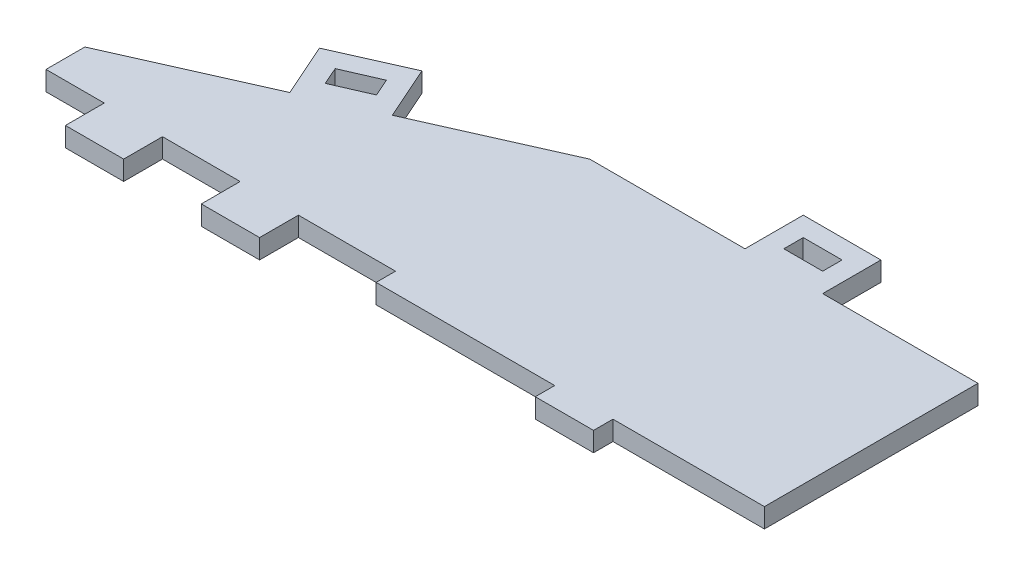
ISO-10303-21;
HEADER;
FILE_DESCRIPTION(('STEP AP214'),'2;1');
FILE_NAME('part.step','',(''),(''),'','','');
FILE_SCHEMA(('AUTOMOTIVE_DESIGN { 1 0 10303 214 1 1 1 1 }'));
ENDSEC;
DATA;
#1=APPLICATION_CONTEXT('core data for automotive mechanical design processes');
#2=APPLICATION_PROTOCOL_DEFINITION('international standard','automotive_design',2000,#1);
#3=PRODUCT_CONTEXT('',#1,'mechanical');
#4=PRODUCT('Part','Part','',(#3));
#5=PRODUCT_RELATED_PRODUCT_CATEGORY('part','',(#4));
#6=PRODUCT_DEFINITION_FORMATION('','',#4);
#7=PRODUCT_DEFINITION_CONTEXT('part definition',#1,'design');
#8=PRODUCT_DEFINITION('design','',#6,#7);
#9=PRODUCT_DEFINITION_SHAPE('','',#8);
#10=(LENGTH_UNIT() NAMED_UNIT(*) SI_UNIT(.MILLI.,.METRE.));
#11=(NAMED_UNIT(*) PLANE_ANGLE_UNIT() SI_UNIT($,.RADIAN.));
#12=(NAMED_UNIT(*) SI_UNIT($,.STERADIAN.) SOLID_ANGLE_UNIT());
#13=UNCERTAINTY_MEASURE_WITH_UNIT(LENGTH_MEASURE(1.E-05),#10,'distance_accuracy_value','');
#14=(GEOMETRIC_REPRESENTATION_CONTEXT(3) GLOBAL_UNCERTAINTY_ASSIGNED_CONTEXT((#13)) GLOBAL_UNIT_ASSIGNED_CONTEXT((#10,
#11,#12)) REPRESENTATION_CONTEXT('',''));
#15=CARTESIAN_POINT('',(0.,0.,0.));
#16=DIRECTION('',(0.,0.,1.));
#17=DIRECTION('',(1.,0.,0.));
#18=AXIS2_PLACEMENT_3D('',#15,#16,#17);
#19=CARTESIAN_POINT('',(0.,5.,0.));
#20=DIRECTION('',(0.,-1.,0.));
#21=DIRECTION('',(0.,0.,-1.));
#22=AXIS2_PLACEMENT_3D('',#19,#20,#21);
#23=PLANE('',#22);
#24=DIRECTION('',(1.,0.,0.));
#25=VECTOR('',#24,1.);
#26=CARTESIAN_POINT('',(135.,5.,-55.));
#27=LINE('',#26,#25);
#28=CARTESIAN_POINT('',(135.,5.,-55.));
#29=VERTEX_POINT('',#28);
#30=CARTESIAN_POINT('',(145.,5.,-55.));
#31=VERTEX_POINT('',#30);
#32=EDGE_CURVE('E298',#29,#31,#27,.T.);
#33=ORIENTED_EDGE('',*,*,#32,.F.);
#34=DIRECTION('',(0.,0.,1.));
#35=VECTOR('',#34,1.);
#36=CARTESIAN_POINT('',(135.,5.,-55.));
#37=LINE('',#36,#35);
#38=CARTESIAN_POINT('',(135.,5.,-60.));
#39=VERTEX_POINT('',#38);
#40=EDGE_CURVE('E306',#39,#29,#37,.T.);
#41=ORIENTED_EDGE('',*,*,#40,.F.);
#42=DIRECTION('',(-1.,0.,0.));
#43=VECTOR('',#42,1.);
#44=CARTESIAN_POINT('',(135.,5.,-60.));
#45=LINE('',#44,#43);
#46=CARTESIAN_POINT('',(145.,5.,-60.));
#47=VERTEX_POINT('',#46);
#48=EDGE_CURVE('E303',#47,#39,#45,.T.);
#49=ORIENTED_EDGE('',*,*,#48,.F.);
#50=DIRECTION('',(0.,0.,-1.));
#51=VECTOR('',#50,1.);
#52=CARTESIAN_POINT('',(145.,5.,-55.));
#53=LINE('',#52,#51);
#54=EDGE_CURVE('E300',#31,#47,#53,.T.);
#55=ORIENTED_EDGE('',*,*,#54,.F.);
#56=EDGE_LOOP('',(#33,#41,#49,#55));
#57=FACE_BOUND('',#56,.T.);
#58=DIRECTION('',(0.,0.,1.));
#59=VECTOR('',#58,1.);
#60=CARTESIAN_POINT('',(0.,5.,0.));
#61=LINE('',#60,#59);
#62=CARTESIAN_POINT('',(0.,5.,-10.));
#63=VERTEX_POINT('',#62);
#64=CARTESIAN_POINT('',(0.,5.,0.));
#65=VERTEX_POINT('',#64);
#66=EDGE_CURVE('E329',#63,#65,#61,.T.);
#67=ORIENTED_EDGE('',*,*,#66,.T.);
#68=DIRECTION('',(1.,0.,0.));
#69=VECTOR('',#68,1.);
#70=CARTESIAN_POINT('',(0.,5.,0.));
#71=LINE('',#70,#69);
#72=CARTESIAN_POINT('',(15.,5.,0.));
#73=VERTEX_POINT('',#72);
#74=EDGE_CURVE('E332',#65,#73,#71,.T.);
#75=ORIENTED_EDGE('',*,*,#74,.T.);
#76=DIRECTION('',(0.,0.,1.));
#77=VECTOR('',#76,1.);
#78=CARTESIAN_POINT('',(15.,5.,0.));
#79=LINE('',#78,#77);
#80=CARTESIAN_POINT('',(15.,5.,10.));
#81=VERTEX_POINT('',#80);
#82=EDGE_CURVE('E335',#73,#81,#79,.T.);
#83=ORIENTED_EDGE('',*,*,#82,.T.);
#84=DIRECTION('',(1.,0.,0.));
#85=VECTOR('',#84,1.);
#86=CARTESIAN_POINT('',(15.,5.,10.));
#87=LINE('',#86,#85);
#88=CARTESIAN_POINT('',(30.,5.,10.));
#89=VERTEX_POINT('',#88);
#90=EDGE_CURVE('E337',#81,#89,#87,.T.);
#91=ORIENTED_EDGE('',*,*,#90,.T.);
#92=DIRECTION('',(0.,0.,-1.));
#93=VECTOR('',#92,1.);
#94=CARTESIAN_POINT('',(30.,5.,10.));
#95=LINE('',#94,#93);
#96=CARTESIAN_POINT('',(30.,5.,0.));
#97=VERTEX_POINT('',#96);
#98=EDGE_CURVE('E339',#89,#97,#95,.T.);
#99=ORIENTED_EDGE('',*,*,#98,.T.);
#100=DIRECTION('',(1.,0.,0.));
#101=VECTOR('',#100,1.);
#102=CARTESIAN_POINT('',(30.,5.,0.));
#103=LINE('',#102,#101);
#104=CARTESIAN_POINT('',(50.,5.,0.));
#105=VERTEX_POINT('',#104);
#106=EDGE_CURVE('E341',#97,#105,#103,.T.);
#107=ORIENTED_EDGE('',*,*,#106,.T.);
#108=DIRECTION('',(0.,0.,1.));
#109=VECTOR('',#108,1.);
#110=CARTESIAN_POINT('',(50.,5.,0.));
#111=LINE('',#110,#109);
#112=CARTESIAN_POINT('',(50.,5.,10.));
#113=VERTEX_POINT('',#112);
#114=EDGE_CURVE('E343',#105,#113,#111,.T.);
#115=ORIENTED_EDGE('',*,*,#114,.T.);
#116=DIRECTION('',(1.,0.,0.));
#117=VECTOR('',#116,1.);
#118=CARTESIAN_POINT('',(50.,5.,10.));
#119=LINE('',#118,#117);
#120=CARTESIAN_POINT('',(65.,5.,10.));
#121=VERTEX_POINT('',#120);
#122=EDGE_CURVE('E345',#113,#121,#119,.T.);
#123=ORIENTED_EDGE('',*,*,#122,.T.);
#124=DIRECTION('',(0.,0.,-1.));
#125=VECTOR('',#124,1.);
#126=CARTESIAN_POINT('',(65.,5.,10.));
#127=LINE('',#126,#125);
#128=CARTESIAN_POINT('',(65.,5.,0.));
#129=VERTEX_POINT('',#128);
#130=EDGE_CURVE('E347',#121,#129,#127,.T.);
#131=ORIENTED_EDGE('',*,*,#130,.T.);
#132=DIRECTION('',(1.,0.,0.));
#133=VECTOR('',#132,1.);
#134=CARTESIAN_POINT('',(65.,5.,0.));
#135=LINE('',#134,#133);
#136=CARTESIAN_POINT('',(90.,5.,0.));
#137=VERTEX_POINT('',#136);
#138=EDGE_CURVE('E349',#129,#137,#135,.T.);
#139=ORIENTED_EDGE('',*,*,#138,.T.);
#140=DIRECTION('',(0.,0.,1.));
#141=VECTOR('',#140,1.);
#142=CARTESIAN_POINT('',(90.,5.,0.));
#143=LINE('',#142,#141);
#144=CARTESIAN_POINT('',(90.,5.,5.));
#145=VERTEX_POINT('',#144);
#146=EDGE_CURVE('E351',#137,#145,#143,.T.);
#147=ORIENTED_EDGE('',*,*,#146,.T.);
#148=DIRECTION('',(1.,0.,0.));
#149=VECTOR('',#148,1.);
#150=CARTESIAN_POINT('',(136.,5.,4.99999999999999));
#151=LINE('',#150,#149);
#152=CARTESIAN_POINT('',(136.,5.,4.99999999999999));
#153=VERTEX_POINT('',#152);
#154=EDGE_CURVE('E353',#145,#153,#151,.T.);
#155=ORIENTED_EDGE('',*,*,#154,.T.);
#156=DIRECTION('',(0.,0.,1.));
#157=VECTOR('',#156,1.);
#158=CARTESIAN_POINT('',(136.,5.,4.99999999999999));
#159=LINE('',#158,#157);
#160=CARTESIAN_POINT('',(136.,5.,9.99999999999999));
#161=VERTEX_POINT('',#160);
#162=EDGE_CURVE('E355',#153,#161,#159,.T.);
#163=ORIENTED_EDGE('',*,*,#162,.T.);
#164=DIRECTION('',(1.,0.,0.));
#165=VECTOR('',#164,1.);
#166=CARTESIAN_POINT('',(136.,5.,9.99999999999999));
#167=LINE('',#166,#165);
#168=CARTESIAN_POINT('',(151.,5.,10.));
#169=VERTEX_POINT('',#168);
#170=EDGE_CURVE('E357',#161,#169,#167,.T.);
#171=ORIENTED_EDGE('',*,*,#170,.T.);
#172=DIRECTION('',(0.,0.,-1.));
#173=VECTOR('',#172,1.);
#174=CARTESIAN_POINT('',(151.,5.,4.99999999999999));
#175=LINE('',#174,#173);
#176=CARTESIAN_POINT('',(151.,5.,4.99999999999999));
#177=VERTEX_POINT('',#176);
#178=EDGE_CURVE('E359',#169,#177,#175,.T.);
#179=ORIENTED_EDGE('',*,*,#178,.T.);
#180=DIRECTION('',(1.,0.,0.));
#181=VECTOR('',#180,1.);
#182=CARTESIAN_POINT('',(190.,5.,4.99999999999999));
#183=LINE('',#182,#181);
#184=CARTESIAN_POINT('',(190.,5.,4.99999999999999));
#185=VERTEX_POINT('',#184);
#186=EDGE_CURVE('E361',#177,#185,#183,.T.);
#187=ORIENTED_EDGE('',*,*,#186,.T.);
#188=DIRECTION('',(0.,0.,-1.));
#189=VECTOR('',#188,1.);
#190=CARTESIAN_POINT('',(190.,5.,-50.));
#191=LINE('',#190,#189);
#192=CARTESIAN_POINT('',(190.,5.,-50.));
#193=VERTEX_POINT('',#192);
#194=EDGE_CURVE('E363',#185,#193,#191,.T.);
#195=ORIENTED_EDGE('',*,*,#194,.T.);
#196=DIRECTION('',(-1.,0.,0.));
#197=VECTOR('',#196,1.);
#198=CARTESIAN_POINT('',(150.,5.,-50.));
#199=LINE('',#198,#197);
#200=CARTESIAN_POINT('',(150.,5.,-50.));
#201=VERTEX_POINT('',#200);
#202=EDGE_CURVE('E365',#193,#201,#199,.T.);
#203=ORIENTED_EDGE('',*,*,#202,.T.);
#204=DIRECTION('',(0.,0.,-1.));
#205=VECTOR('',#204,1.);
#206=CARTESIAN_POINT('',(150.,5.,-50.));
#207=LINE('',#206,#205);
#208=CARTESIAN_POINT('',(150.,5.,-65.));
#209=VERTEX_POINT('',#208);
#210=EDGE_CURVE('E367',#201,#209,#207,.T.);
#211=ORIENTED_EDGE('',*,*,#210,.T.);
#212=DIRECTION('',(-1.,0.,0.));
#213=VECTOR('',#212,1.);
#214=CARTESIAN_POINT('',(130.,5.,-65.));
#215=LINE('',#214,#213);
#216=CARTESIAN_POINT('',(130.,5.,-65.));
#217=VERTEX_POINT('',#216);
#218=EDGE_CURVE('E369',#209,#217,#215,.T.);
#219=ORIENTED_EDGE('',*,*,#218,.T.);
#220=DIRECTION('',(0.,0.,1.));
#221=VECTOR('',#220,1.);
#222=CARTESIAN_POINT('',(130.,5.,-50.));
#223=LINE('',#222,#221);
#224=CARTESIAN_POINT('',(130.,5.,-50.));
#225=VERTEX_POINT('',#224);
#226=EDGE_CURVE('E371',#217,#225,#223,.T.);
#227=ORIENTED_EDGE('',*,*,#226,.T.);
#228=DIRECTION('',(-1.,0.,0.));
#229=VECTOR('',#228,1.);
#230=CARTESIAN_POINT('',(90.,5.,-50.));
#231=LINE('',#230,#229);
#232=CARTESIAN_POINT('',(90.,5.,-50.));
#233=VERTEX_POINT('',#232);
#234=EDGE_CURVE('E373',#225,#233,#231,.T.);
#235=ORIENTED_EDGE('',*,*,#234,.T.);
#236=DIRECTION('',(-0.913811548620257,0.,0.406138466053448));
#237=VECTOR('',#236,1.);
#238=CARTESIAN_POINT('',(54.8286929172154,5.,-34.3683079632069));
#239=LINE('',#238,#237);
#240=CARTESIAN_POINT('',(54.8286929172154,5.,-34.3683079632069));
#241=VERTEX_POINT('',#240);
#242=EDGE_CURVE('E375',#233,#241,#239,.T.);
#243=ORIENTED_EDGE('',*,*,#242,.T.);
#244=DIRECTION('',(-0.406138466053448,0.,-0.913811548620257));
#245=VECTOR('',#244,1.);
#246=CARTESIAN_POINT('',(48.7366159264137,5.,-48.0754811925107));
#247=LINE('',#246,#245);
#248=CARTESIAN_POINT('',(48.7366159264137,5.,-48.0754811925107));
#249=VERTEX_POINT('',#248);
#250=EDGE_CURVE('E377',#241,#249,#247,.T.);
#251=ORIENTED_EDGE('',*,*,#250,.T.);
#252=DIRECTION('',(-0.913811548620257,0.,0.406138466053448));
#253=VECTOR('',#252,1.);
#254=CARTESIAN_POINT('',(30.4603849540086,5.,-39.9527118714418));
#255=LINE('',#254,#253);
#256=CARTESIAN_POINT('',(30.4603849540086,5.,-39.9527118714418));
#257=VERTEX_POINT('',#256);
#258=EDGE_CURVE('E379',#249,#257,#255,.T.);
#259=ORIENTED_EDGE('',*,*,#258,.T.);
#260=DIRECTION('',(0.406138466053448,0.,0.913811548620257));
#261=VECTOR('',#260,1.);
#262=CARTESIAN_POINT('',(36.5524619448103,5.,-26.2455386421379));
#263=LINE('',#262,#261);
#264=CARTESIAN_POINT('',(36.5524619448103,5.,-26.2455386421379));
#265=VERTEX_POINT('',#264);
#266=EDGE_CURVE('E381',#257,#265,#263,.T.);
#267=ORIENTED_EDGE('',*,*,#266,.T.);
#268=DIRECTION('',(-0.913811548620257,0.,0.406138466053448));
#269=VECTOR('',#268,1.);
#270=CARTESIAN_POINT('',(0.,5.,-10.));
#271=LINE('',#270,#269);
#272=EDGE_CURVE('E383',#265,#63,#271,.T.);
#273=ORIENTED_EDGE('',*,*,#272,.T.);
#274=EDGE_LOOP('',(#67,#75,#83,#91,#99,#107,#115,#123,#131,#139,#147,#155,#163,#171,#179,#187,
#195,#203,#211,#219,#227,#235,#243,#251,#259,#267,#273));
#275=FACE_BOUND('',#274,.T.);
#276=DIRECTION('',(-0.916397442732683,0.,0.400269567857712));
#277=VECTOR('',#276,1.);
#278=CARTESIAN_POINT('',(37.0601350273771,5.,-37.4143464586077));
#279=LINE('',#278,#277);
#280=CARTESIAN_POINT('',(46.2241094547039,5.,-41.4170421371849));
#281=VERTEX_POINT('',#280);
#282=CARTESIAN_POINT('',(37.0601350273771,5.,-37.4143464586077));
#283=VERTEX_POINT('',#282);
#284=EDGE_CURVE('E262',#281,#283,#279,.T.);
#285=ORIENTED_EDGE('',*,*,#284,.F.);
#286=DIRECTION('',(-0.406138466053447,0.,-0.913811548620258));
#287=VECTOR('',#286,1.);
#288=CARTESIAN_POINT('',(46.2241094547039,5.,-41.4170421371849));
#289=LINE('',#288,#287);
#290=CARTESIAN_POINT('',(48.2548017849711,5.,-36.8479843940836));
#291=VERTEX_POINT('',#290);
#292=EDGE_CURVE('E284',#291,#281,#289,.T.);
#293=ORIENTED_EDGE('',*,*,#292,.F.);
#294=DIRECTION('',(0.916393339987129,0.,-0.40027896076016));
#295=VECTOR('',#294,1.);
#296=CARTESIAN_POINT('',(39.0614828666657,5.,-32.8323592449443));
#297=LINE('',#296,#295);
#298=CARTESIAN_POINT('',(39.0614828666657,5.,-32.8323592449443));
#299=VERTEX_POINT('',#298);
#300=EDGE_CURVE('E282',#299,#291,#297,.T.);
#301=ORIENTED_EDGE('',*,*,#300,.F.);
#302=DIRECTION('',(0.400269567857716,0.,0.916397442732681));
#303=VECTOR('',#302,1.);
#304=CARTESIAN_POINT('',(39.0614828666657,5.,-32.8323592449443));
#305=LINE('',#304,#303);
#306=EDGE_CURVE('E270',#283,#299,#305,.T.);
#307=ORIENTED_EDGE('',*,*,#306,.F.);
#308=EDGE_LOOP('',(#285,#293,#301,#307));
#309=FACE_BOUND('',#308,.T.);
#310=ADVANCED_FACE('F35',(#57,#275,#309),#23,.F.);
#311=CARTESIAN_POINT('',(0.,0.,0.));
#312=DIRECTION('',(0.,-1.,0.));
#313=DIRECTION('',(0.,0.,-1.));
#314=AXIS2_PLACEMENT_3D('',#311,#312,#313);
#315=PLANE('',#314);
#316=DIRECTION('',(0.,0.,1.));
#317=VECTOR('',#316,1.);
#318=CARTESIAN_POINT('',(0.,0.,0.));
#319=LINE('',#318,#317);
#320=CARTESIAN_POINT('',(0.,0.,-10.));
#321=VERTEX_POINT('',#320);
#322=CARTESIAN_POINT('',(0.,0.,0.));
#323=VERTEX_POINT('',#322);
#324=EDGE_CURVE('E328',#321,#323,#319,.T.);
#325=ORIENTED_EDGE('',*,*,#324,.F.);
#326=DIRECTION('',(-0.913811548620257,0.,0.406138466053448));
#327=VECTOR('',#326,1.);
#328=CARTESIAN_POINT('',(0.,0.,-10.));
#329=LINE('',#328,#327);
#330=CARTESIAN_POINT('',(36.5524619448103,0.,-26.2455386421379));
#331=VERTEX_POINT('',#330);
#332=EDGE_CURVE('E333',#331,#321,#329,.T.);
#333=ORIENTED_EDGE('',*,*,#332,.F.);
#334=DIRECTION('',(0.406138466053448,0.,0.913811548620257));
#335=VECTOR('',#334,1.);
#336=CARTESIAN_POINT('',(36.5524619448103,0.,-26.2455386421379));
#337=LINE('',#336,#335);
#338=CARTESIAN_POINT('',(30.4603849540086,0.,-39.9527118714418));
#339=VERTEX_POINT('',#338);
#340=EDGE_CURVE('E436',#339,#331,#337,.T.);
#341=ORIENTED_EDGE('',*,*,#340,.F.);
#342=DIRECTION('',(-0.913811548620257,0.,0.406138466053448));
#343=VECTOR('',#342,1.);
#344=CARTESIAN_POINT('',(30.4603849540086,0.,-39.9527118714418));
#345=LINE('',#344,#343);
#346=CARTESIAN_POINT('',(48.7366159264137,0.,-48.0754811925107));
#347=VERTEX_POINT('',#346);
#348=EDGE_CURVE('E434',#347,#339,#345,.T.);
#349=ORIENTED_EDGE('',*,*,#348,.F.);
#350=DIRECTION('',(-0.406138466053448,0.,-0.913811548620257));
#351=VECTOR('',#350,1.);
#352=CARTESIAN_POINT('',(48.7366159264137,0.,-48.0754811925107));
#353=LINE('',#352,#351);
#354=CARTESIAN_POINT('',(54.8286929172154,0.,-34.3683079632069));
#355=VERTEX_POINT('',#354);
#356=EDGE_CURVE('E432',#355,#347,#353,.T.);
#357=ORIENTED_EDGE('',*,*,#356,.F.);
#358=DIRECTION('',(-0.913811548620257,0.,0.406138466053448));
#359=VECTOR('',#358,1.);
#360=CARTESIAN_POINT('',(54.8286929172154,0.,-34.3683079632069));
#361=LINE('',#360,#359);
#362=CARTESIAN_POINT('',(90.,0.,-50.));
#363=VERTEX_POINT('',#362);
#364=EDGE_CURVE('E430',#363,#355,#361,.T.);
#365=ORIENTED_EDGE('',*,*,#364,.F.);
#366=DIRECTION('',(-1.,0.,0.));
#367=VECTOR('',#366,1.);
#368=CARTESIAN_POINT('',(90.,0.,-50.));
#369=LINE('',#368,#367);
#370=CARTESIAN_POINT('',(130.,0.,-50.));
#371=VERTEX_POINT('',#370);
#372=EDGE_CURVE('E428',#371,#363,#369,.T.);
#373=ORIENTED_EDGE('',*,*,#372,.F.);
#374=DIRECTION('',(0.,0.,1.));
#375=VECTOR('',#374,1.);
#376=CARTESIAN_POINT('',(130.,0.,-50.));
#377=LINE('',#376,#375);
#378=CARTESIAN_POINT('',(130.,0.,-65.));
#379=VERTEX_POINT('',#378);
#380=EDGE_CURVE('E426',#379,#371,#377,.T.);
#381=ORIENTED_EDGE('',*,*,#380,.F.);
#382=DIRECTION('',(-1.,0.,0.));
#383=VECTOR('',#382,1.);
#384=CARTESIAN_POINT('',(130.,0.,-65.));
#385=LINE('',#384,#383);
#386=CARTESIAN_POINT('',(150.,0.,-65.));
#387=VERTEX_POINT('',#386);
#388=EDGE_CURVE('E424',#387,#379,#385,.T.);
#389=ORIENTED_EDGE('',*,*,#388,.F.);
#390=DIRECTION('',(0.,0.,-1.));
#391=VECTOR('',#390,1.);
#392=CARTESIAN_POINT('',(150.,0.,-50.));
#393=LINE('',#392,#391);
#394=CARTESIAN_POINT('',(150.,0.,-50.));
#395=VERTEX_POINT('',#394);
#396=EDGE_CURVE('E422',#395,#387,#393,.T.);
#397=ORIENTED_EDGE('',*,*,#396,.F.);
#398=DIRECTION('',(-1.,0.,0.));
#399=VECTOR('',#398,1.);
#400=CARTESIAN_POINT('',(150.,0.,-50.));
#401=LINE('',#400,#399);
#402=CARTESIAN_POINT('',(190.,0.,-50.));
#403=VERTEX_POINT('',#402);
#404=EDGE_CURVE('E420',#403,#395,#401,.T.);
#405=ORIENTED_EDGE('',*,*,#404,.F.);
#406=DIRECTION('',(0.,0.,-1.));
#407=VECTOR('',#406,1.);
#408=CARTESIAN_POINT('',(190.,0.,-50.));
#409=LINE('',#408,#407);
#410=CARTESIAN_POINT('',(190.,0.,4.99999999999999));
#411=VERTEX_POINT('',#410);
#412=EDGE_CURVE('E418',#411,#403,#409,.T.);
#413=ORIENTED_EDGE('',*,*,#412,.F.);
#414=DIRECTION('',(1.,0.,0.));
#415=VECTOR('',#414,1.);
#416=CARTESIAN_POINT('',(190.,0.,4.99999999999999));
#417=LINE('',#416,#415);
#418=CARTESIAN_POINT('',(151.,0.,4.99999999999999));
#419=VERTEX_POINT('',#418);
#420=EDGE_CURVE('E416',#419,#411,#417,.T.);
#421=ORIENTED_EDGE('',*,*,#420,.F.);
#422=DIRECTION('',(0.,0.,-1.));
#423=VECTOR('',#422,1.);
#424=CARTESIAN_POINT('',(151.,0.,4.99999999999999));
#425=LINE('',#424,#423);
#426=CARTESIAN_POINT('',(151.,0.,10.));
#427=VERTEX_POINT('',#426);
#428=EDGE_CURVE('E414',#427,#419,#425,.T.);
#429=ORIENTED_EDGE('',*,*,#428,.F.);
#430=DIRECTION('',(1.,0.,0.));
#431=VECTOR('',#430,1.);
#432=CARTESIAN_POINT('',(136.,0.,9.99999999999999));
#433=LINE('',#432,#431);
#434=CARTESIAN_POINT('',(136.,0.,9.99999999999999));
#435=VERTEX_POINT('',#434);
#436=EDGE_CURVE('E412',#435,#427,#433,.T.);
#437=ORIENTED_EDGE('',*,*,#436,.F.);
#438=DIRECTION('',(0.,0.,1.));
#439=VECTOR('',#438,1.);
#440=CARTESIAN_POINT('',(136.,0.,4.99999999999999));
#441=LINE('',#440,#439);
#442=CARTESIAN_POINT('',(136.,0.,4.99999999999999));
#443=VERTEX_POINT('',#442);
#444=EDGE_CURVE('E410',#443,#435,#441,.T.);
#445=ORIENTED_EDGE('',*,*,#444,.F.);
#446=DIRECTION('',(1.,0.,0.));
#447=VECTOR('',#446,1.);
#448=CARTESIAN_POINT('',(136.,0.,4.99999999999999));
#449=LINE('',#448,#447);
#450=CARTESIAN_POINT('',(90.,0.,5.));
#451=VERTEX_POINT('',#450);
#452=EDGE_CURVE('E408',#451,#443,#449,.T.);
#453=ORIENTED_EDGE('',*,*,#452,.F.);
#454=DIRECTION('',(0.,0.,1.));
#455=VECTOR('',#454,1.);
#456=CARTESIAN_POINT('',(90.,0.,0.));
#457=LINE('',#456,#455);
#458=CARTESIAN_POINT('',(90.,0.,0.));
#459=VERTEX_POINT('',#458);
#460=EDGE_CURVE('E406',#459,#451,#457,.T.);
#461=ORIENTED_EDGE('',*,*,#460,.F.);
#462=DIRECTION('',(1.,0.,0.));
#463=VECTOR('',#462,1.);
#464=CARTESIAN_POINT('',(65.,0.,0.));
#465=LINE('',#464,#463);
#466=CARTESIAN_POINT('',(65.,0.,0.));
#467=VERTEX_POINT('',#466);
#468=EDGE_CURVE('E404',#467,#459,#465,.T.);
#469=ORIENTED_EDGE('',*,*,#468,.F.);
#470=DIRECTION('',(0.,0.,-1.));
#471=VECTOR('',#470,1.);
#472=CARTESIAN_POINT('',(65.,0.,10.));
#473=LINE('',#472,#471);
#474=CARTESIAN_POINT('',(65.,0.,10.));
#475=VERTEX_POINT('',#474);
#476=EDGE_CURVE('E402',#475,#467,#473,.T.);
#477=ORIENTED_EDGE('',*,*,#476,.F.);
#478=DIRECTION('',(1.,0.,0.));
#479=VECTOR('',#478,1.);
#480=CARTESIAN_POINT('',(50.,0.,10.));
#481=LINE('',#480,#479);
#482=CARTESIAN_POINT('',(50.,0.,10.));
#483=VERTEX_POINT('',#482);
#484=EDGE_CURVE('E400',#483,#475,#481,.T.);
#485=ORIENTED_EDGE('',*,*,#484,.F.);
#486=DIRECTION('',(0.,0.,1.));
#487=VECTOR('',#486,1.);
#488=CARTESIAN_POINT('',(50.,0.,0.));
#489=LINE('',#488,#487);
#490=CARTESIAN_POINT('',(50.,0.,0.));
#491=VERTEX_POINT('',#490);
#492=EDGE_CURVE('E398',#491,#483,#489,.T.);
#493=ORIENTED_EDGE('',*,*,#492,.F.);
#494=DIRECTION('',(1.,0.,0.));
#495=VECTOR('',#494,1.);
#496=CARTESIAN_POINT('',(30.,0.,0.));
#497=LINE('',#496,#495);
#498=CARTESIAN_POINT('',(30.,0.,0.));
#499=VERTEX_POINT('',#498);
#500=EDGE_CURVE('E396',#499,#491,#497,.T.);
#501=ORIENTED_EDGE('',*,*,#500,.F.);
#502=DIRECTION('',(0.,0.,-1.));
#503=VECTOR('',#502,1.);
#504=CARTESIAN_POINT('',(30.,0.,10.));
#505=LINE('',#504,#503);
#506=CARTESIAN_POINT('',(30.,0.,10.));
#507=VERTEX_POINT('',#506);
#508=EDGE_CURVE('E394',#507,#499,#505,.T.);
#509=ORIENTED_EDGE('',*,*,#508,.F.);
#510=DIRECTION('',(1.,0.,0.));
#511=VECTOR('',#510,1.);
#512=CARTESIAN_POINT('',(15.,0.,10.));
#513=LINE('',#512,#511);
#514=CARTESIAN_POINT('',(15.,0.,10.));
#515=VERTEX_POINT('',#514);
#516=EDGE_CURVE('E392',#515,#507,#513,.T.);
#517=ORIENTED_EDGE('',*,*,#516,.F.);
#518=DIRECTION('',(0.,0.,1.));
#519=VECTOR('',#518,1.);
#520=CARTESIAN_POINT('',(15.,0.,0.));
#521=LINE('',#520,#519);
#522=CARTESIAN_POINT('',(15.,0.,0.));
#523=VERTEX_POINT('',#522);
#524=EDGE_CURVE('E390',#523,#515,#521,.T.);
#525=ORIENTED_EDGE('',*,*,#524,.F.);
#526=DIRECTION('',(1.,0.,0.));
#527=VECTOR('',#526,1.);
#528=CARTESIAN_POINT('',(0.,0.,0.));
#529=LINE('',#528,#527);
#530=EDGE_CURVE('E388',#323,#523,#529,.T.);
#531=ORIENTED_EDGE('',*,*,#530,.F.);
#532=EDGE_LOOP('',(#325,#333,#341,#349,#357,#365,#373,#381,#389,#397,#405,#413,#421,#429,#437,
#445,#453,#461,#469,#477,#485,#493,#501,#509,#517,#525,#531));
#533=FACE_BOUND('',#532,.T.);
#534=DIRECTION('',(0.,0.,1.));
#535=VECTOR('',#534,1.);
#536=CARTESIAN_POINT('',(135.,0.,-55.));
#537=LINE('',#536,#535);
#538=CARTESIAN_POINT('',(135.,0.,-60.));
#539=VERTEX_POINT('',#538);
#540=CARTESIAN_POINT('',(135.,0.,-55.));
#541=VERTEX_POINT('',#540);
#542=EDGE_CURVE('E301',#539,#541,#537,.T.);
#543=ORIENTED_EDGE('',*,*,#542,.T.);
#544=DIRECTION('',(1.,0.,0.));
#545=VECTOR('',#544,1.);
#546=CARTESIAN_POINT('',(135.,0.,-55.));
#547=LINE('',#546,#545);
#548=CARTESIAN_POINT('',(145.,0.,-55.));
#549=VERTEX_POINT('',#548);
#550=EDGE_CURVE('E278',#541,#549,#547,.T.);
#551=ORIENTED_EDGE('',*,*,#550,.T.);
#552=DIRECTION('',(0.,0.,-1.));
#553=VECTOR('',#552,1.);
#554=CARTESIAN_POINT('',(145.,0.,-55.));
#555=LINE('',#554,#553);
#556=CARTESIAN_POINT('',(145.,0.,-60.));
#557=VERTEX_POINT('',#556);
#558=EDGE_CURVE('E311',#549,#557,#555,.T.);
#559=ORIENTED_EDGE('',*,*,#558,.T.);
#560=DIRECTION('',(-1.,0.,0.));
#561=VECTOR('',#560,1.);
#562=CARTESIAN_POINT('',(135.,0.,-60.));
#563=LINE('',#562,#561);
#564=EDGE_CURVE('E314',#557,#539,#563,.T.);
#565=ORIENTED_EDGE('',*,*,#564,.T.);
#566=EDGE_LOOP('',(#543,#551,#559,#565));
#567=FACE_BOUND('',#566,.T.);
#568=DIRECTION('',(-0.406138466053447,0.,-0.913811548620258));
#569=VECTOR('',#568,1.);
#570=CARTESIAN_POINT('',(46.2241094547039,0.,-41.4170421371849));
#571=LINE('',#570,#569);
#572=CARTESIAN_POINT('',(48.2548017849711,0.,-36.8479843940836));
#573=VERTEX_POINT('',#572);
#574=CARTESIAN_POINT('',(46.2241094547039,0.,-41.4170421371849));
#575=VERTEX_POINT('',#574);
#576=EDGE_CURVE('E271',#573,#575,#571,.T.);
#577=ORIENTED_EDGE('',*,*,#576,.T.);
#578=DIRECTION('',(-0.916397442732683,0.,0.400269567857712));
#579=VECTOR('',#578,1.);
#580=CARTESIAN_POINT('',(37.0601350273771,0.,-37.4143464586077));
#581=LINE('',#580,#579);
#582=CARTESIAN_POINT('',(37.0601350273771,0.,-37.4143464586077));
#583=VERTEX_POINT('',#582);
#584=EDGE_CURVE('E58',#575,#583,#581,.T.);
#585=ORIENTED_EDGE('',*,*,#584,.T.);
#586=DIRECTION('',(0.400269567857716,0.,0.916397442732681));
#587=VECTOR('',#586,1.);
#588=CARTESIAN_POINT('',(39.0614828666657,0.,-32.8323592449443));
#589=LINE('',#588,#587);
#590=CARTESIAN_POINT('',(39.0614828666657,0.,-32.8323592449443));
#591=VERTEX_POINT('',#590);
#592=EDGE_CURVE('E277',#583,#591,#589,.T.);
#593=ORIENTED_EDGE('',*,*,#592,.T.);
#594=DIRECTION('',(0.916393339987129,0.,-0.40027896076016));
#595=VECTOR('',#594,1.);
#596=CARTESIAN_POINT('',(39.0614828666657,0.,-32.8323592449443));
#597=LINE('',#596,#595);
#598=EDGE_CURVE('E290',#591,#573,#597,.T.);
#599=ORIENTED_EDGE('',*,*,#598,.T.);
#600=EDGE_LOOP('',(#577,#585,#593,#599));
#601=FACE_BOUND('',#600,.T.);
#602=ADVANCED_FACE('F523',(#533,#567,#601),#315,.T.);
#603=CARTESIAN_POINT('',(0.,5.,0.));
#604=DIRECTION('',(1.,0.,0.));
#605=DIRECTION('',(0.,0.,-1.));
#606=AXIS2_PLACEMENT_3D('',#603,#604,#605);
#607=PLANE('',#606);
#608=ORIENTED_EDGE('',*,*,#324,.T.);
#609=DIRECTION('',(0.,-1.,0.));
#610=VECTOR('',#609,1.);
#611=CARTESIAN_POINT('',(0.,5.,0.));
#612=LINE('',#611,#610);
#613=EDGE_CURVE('E11',#65,#323,#612,.T.);
#614=ORIENTED_EDGE('',*,*,#613,.F.);
#615=ORIENTED_EDGE('',*,*,#66,.F.);
#616=DIRECTION('',(0.,-1.,0.));
#617=VECTOR('',#616,1.);
#618=CARTESIAN_POINT('',(0.,5.,-10.));
#619=LINE('',#618,#617);
#620=EDGE_CURVE('E385',#63,#321,#619,.T.);
#621=ORIENTED_EDGE('',*,*,#620,.T.);
#622=EDGE_LOOP('',(#608,#614,#615,#621));
#623=FACE_BOUND('',#622,.T.);
#624=ADVANCED_FACE('F37',(#623),#607,.F.);
#625=CARTESIAN_POINT('',(0.,5.,0.));
#626=DIRECTION('',(0.,0.,-1.));
#627=DIRECTION('',(-1.,0.,0.));
#628=AXIS2_PLACEMENT_3D('',#625,#626,#627);
#629=PLANE('',#628);
#630=ORIENTED_EDGE('',*,*,#530,.T.);
#631=DIRECTION('',(0.,-1.,0.));
#632=VECTOR('',#631,1.);
#633=CARTESIAN_POINT('',(15.,5.,0.));
#634=LINE('',#633,#632);
#635=EDGE_CURVE('E43',#73,#523,#634,.T.);
#636=ORIENTED_EDGE('',*,*,#635,.F.);
#637=ORIENTED_EDGE('',*,*,#74,.F.);
#638=ORIENTED_EDGE('',*,*,#613,.T.);
#639=EDGE_LOOP('',(#630,#636,#637,#638));
#640=FACE_BOUND('',#639,.T.);
#641=ADVANCED_FACE('F540',(#640),#629,.F.);
#642=CARTESIAN_POINT('',(15.,5.,0.));
#643=DIRECTION('',(1.,0.,0.));
#644=DIRECTION('',(0.,0.,-1.));
#645=AXIS2_PLACEMENT_3D('',#642,#643,#644);
#646=PLANE('',#645);
#647=ORIENTED_EDGE('',*,*,#524,.T.);
#648=DIRECTION('',(0.,-1.,0.));
#649=VECTOR('',#648,1.);
#650=CARTESIAN_POINT('',(15.,5.,10.));
#651=LINE('',#650,#649);
#652=EDGE_CURVE('E510',#81,#515,#651,.T.);
#653=ORIENTED_EDGE('',*,*,#652,.F.);
#654=ORIENTED_EDGE('',*,*,#82,.F.);
#655=ORIENTED_EDGE('',*,*,#635,.T.);
#656=EDGE_LOOP('',(#647,#653,#654,#655));
#657=FACE_BOUND('',#656,.T.);
#658=ADVANCED_FACE('F517',(#657),#646,.F.);
#659=CARTESIAN_POINT('',(15.,5.,10.));
#660=DIRECTION('',(0.,0.,-1.));
#661=DIRECTION('',(-1.,0.,0.));
#662=AXIS2_PLACEMENT_3D('',#659,#660,#661);
#663=PLANE('',#662);
#664=ORIENTED_EDGE('',*,*,#516,.T.);
#665=DIRECTION('',(0.,-1.,0.));
#666=VECTOR('',#665,1.);
#667=CARTESIAN_POINT('',(30.,5.,10.));
#668=LINE('',#667,#666);
#669=EDGE_CURVE('E507',#89,#507,#668,.T.);
#670=ORIENTED_EDGE('',*,*,#669,.F.);
#671=ORIENTED_EDGE('',*,*,#90,.F.);
#672=ORIENTED_EDGE('',*,*,#652,.T.);
#673=EDGE_LOOP('',(#664,#670,#671,#672));
#674=FACE_BOUND('',#673,.T.);
#675=ADVANCED_FACE('F529',(#674),#663,.F.);
#676=CARTESIAN_POINT('',(30.,5.,10.));
#677=DIRECTION('',(-1.,0.,0.));
#678=DIRECTION('',(0.,0.,1.));
#679=AXIS2_PLACEMENT_3D('',#676,#677,#678);
#680=PLANE('',#679);
#681=ORIENTED_EDGE('',*,*,#508,.T.);
#682=DIRECTION('',(0.,-1.,0.));
#683=VECTOR('',#682,1.);
#684=CARTESIAN_POINT('',(30.,5.,0.));
#685=LINE('',#684,#683);
#686=EDGE_CURVE('E504',#97,#499,#685,.T.);
#687=ORIENTED_EDGE('',*,*,#686,.F.);
#688=ORIENTED_EDGE('',*,*,#98,.F.);
#689=ORIENTED_EDGE('',*,*,#669,.T.);
#690=EDGE_LOOP('',(#681,#687,#688,#689));
#691=FACE_BOUND('',#690,.T.);
#692=ADVANCED_FACE('F533',(#691),#680,.F.);
#693=CARTESIAN_POINT('',(30.,5.,0.));
#694=DIRECTION('',(0.,0.,-1.));
#695=DIRECTION('',(-1.,0.,0.));
#696=AXIS2_PLACEMENT_3D('',#693,#694,#695);
#697=PLANE('',#696);
#698=ORIENTED_EDGE('',*,*,#500,.T.);
#699=DIRECTION('',(0.,-1.,0.));
#700=VECTOR('',#699,1.);
#701=CARTESIAN_POINT('',(50.,5.,0.));
#702=LINE('',#701,#700);
#703=EDGE_CURVE('E501',#105,#491,#702,.T.);
#704=ORIENTED_EDGE('',*,*,#703,.F.);
#705=ORIENTED_EDGE('',*,*,#106,.F.);
#706=ORIENTED_EDGE('',*,*,#686,.T.);
#707=EDGE_LOOP('',(#698,#704,#705,#706));
#708=FACE_BOUND('',#707,.T.);
#709=ADVANCED_FACE('F648',(#708),#697,.F.);
#710=CARTESIAN_POINT('',(50.,5.,0.));
#711=DIRECTION('',(1.,0.,0.));
#712=DIRECTION('',(0.,0.,-1.));
#713=AXIS2_PLACEMENT_3D('',#710,#711,#712);
#714=PLANE('',#713);
#715=ORIENTED_EDGE('',*,*,#492,.T.);
#716=DIRECTION('',(0.,-1.,0.));
#717=VECTOR('',#716,1.);
#718=CARTESIAN_POINT('',(50.,5.,10.));
#719=LINE('',#718,#717);
#720=EDGE_CURVE('E498',#113,#483,#719,.T.);
#721=ORIENTED_EDGE('',*,*,#720,.F.);
#722=ORIENTED_EDGE('',*,*,#114,.F.);
#723=ORIENTED_EDGE('',*,*,#703,.T.);
#724=EDGE_LOOP('',(#715,#721,#722,#723));
#725=FACE_BOUND('',#724,.T.);
#726=ADVANCED_FACE('F646',(#725),#714,.F.);
#727=CARTESIAN_POINT('',(50.,5.,10.));
#728=DIRECTION('',(0.,0.,-1.));
#729=DIRECTION('',(-1.,0.,0.));
#730=AXIS2_PLACEMENT_3D('',#727,#728,#729);
#731=PLANE('',#730);
#732=ORIENTED_EDGE('',*,*,#484,.T.);
#733=DIRECTION('',(0.,-1.,0.));
#734=VECTOR('',#733,1.);
#735=CARTESIAN_POINT('',(65.,5.,10.));
#736=LINE('',#735,#734);
#737=EDGE_CURVE('E495',#121,#475,#736,.T.);
#738=ORIENTED_EDGE('',*,*,#737,.F.);
#739=ORIENTED_EDGE('',*,*,#122,.F.);
#740=ORIENTED_EDGE('',*,*,#720,.T.);
#741=EDGE_LOOP('',(#732,#738,#739,#740));
#742=FACE_BOUND('',#741,.T.);
#743=ADVANCED_FACE('F642',(#742),#731,.F.);
#744=CARTESIAN_POINT('',(65.,5.,10.));
#745=DIRECTION('',(-1.,0.,0.));
#746=DIRECTION('',(0.,0.,1.));
#747=AXIS2_PLACEMENT_3D('',#744,#745,#746);
#748=PLANE('',#747);
#749=ORIENTED_EDGE('',*,*,#476,.T.);
#750=DIRECTION('',(0.,-1.,0.));
#751=VECTOR('',#750,1.);
#752=CARTESIAN_POINT('',(65.,5.,0.));
#753=LINE('',#752,#751);
#754=EDGE_CURVE('E492',#129,#467,#753,.T.);
#755=ORIENTED_EDGE('',*,*,#754,.F.);
#756=ORIENTED_EDGE('',*,*,#130,.F.);
#757=ORIENTED_EDGE('',*,*,#737,.T.);
#758=EDGE_LOOP('',(#749,#755,#756,#757));
#759=FACE_BOUND('',#758,.T.);
#760=ADVANCED_FACE('F637',(#759),#748,.F.);
#761=CARTESIAN_POINT('',(65.,5.,0.));
#762=DIRECTION('',(0.,0.,-1.));
#763=DIRECTION('',(-1.,0.,0.));
#764=AXIS2_PLACEMENT_3D('',#761,#762,#763);
#765=PLANE('',#764);
#766=ORIENTED_EDGE('',*,*,#468,.T.);
#767=DIRECTION('',(0.,-1.,0.));
#768=VECTOR('',#767,1.);
#769=CARTESIAN_POINT('',(90.,5.,0.));
#770=LINE('',#769,#768);
#771=EDGE_CURVE('E489',#137,#459,#770,.T.);
#772=ORIENTED_EDGE('',*,*,#771,.F.);
#773=ORIENTED_EDGE('',*,*,#138,.F.);
#774=ORIENTED_EDGE('',*,*,#754,.T.);
#775=EDGE_LOOP('',(#766,#772,#773,#774));
#776=FACE_BOUND('',#775,.T.);
#777=ADVANCED_FACE('F631',(#776),#765,.F.);
#778=CARTESIAN_POINT('',(90.,5.,0.));
#779=DIRECTION('',(1.,0.,0.));
#780=DIRECTION('',(0.,0.,-1.));
#781=AXIS2_PLACEMENT_3D('',#778,#779,#780);
#782=PLANE('',#781);
#783=ORIENTED_EDGE('',*,*,#460,.T.);
#784=DIRECTION('',(0.,-1.,0.));
#785=VECTOR('',#784,1.);
#786=CARTESIAN_POINT('',(90.,5.,5.));
#787=LINE('',#786,#785);
#788=EDGE_CURVE('E486',#145,#451,#787,.T.);
#789=ORIENTED_EDGE('',*,*,#788,.F.);
#790=ORIENTED_EDGE('',*,*,#146,.F.);
#791=ORIENTED_EDGE('',*,*,#771,.T.);
#792=EDGE_LOOP('',(#783,#789,#790,#791));
#793=FACE_BOUND('',#792,.T.);
#794=ADVANCED_FACE('F627',(#793),#782,.F.);
#795=CARTESIAN_POINT('',(136.,5.,4.99999999999999));
#796=DIRECTION('',(0.,0.,-1.));
#797=DIRECTION('',(-1.,0.,0.));
#798=AXIS2_PLACEMENT_3D('',#795,#796,#797);
#799=PLANE('',#798);
#800=ORIENTED_EDGE('',*,*,#452,.T.);
#801=DIRECTION('',(0.,-1.,0.));
#802=VECTOR('',#801,1.);
#803=CARTESIAN_POINT('',(136.,5.,4.99999999999999));
#804=LINE('',#803,#802);
#805=EDGE_CURVE('E483',#153,#443,#804,.T.);
#806=ORIENTED_EDGE('',*,*,#805,.F.);
#807=ORIENTED_EDGE('',*,*,#154,.F.);
#808=ORIENTED_EDGE('',*,*,#788,.T.);
#809=EDGE_LOOP('',(#800,#806,#807,#808));
#810=FACE_BOUND('',#809,.T.);
#811=ADVANCED_FACE('F622',(#810),#799,.F.);
#812=CARTESIAN_POINT('',(136.,5.,4.99999999999999));
#813=DIRECTION('',(1.,0.,0.));
#814=DIRECTION('',(0.,0.,-1.));
#815=AXIS2_PLACEMENT_3D('',#812,#813,#814);
#816=PLANE('',#815);
#817=ORIENTED_EDGE('',*,*,#444,.T.);
#818=DIRECTION('',(0.,-1.,0.));
#819=VECTOR('',#818,1.);
#820=CARTESIAN_POINT('',(136.,5.,9.99999999999999));
#821=LINE('',#820,#819);
#822=EDGE_CURVE('E480',#161,#435,#821,.T.);
#823=ORIENTED_EDGE('',*,*,#822,.F.);
#824=ORIENTED_EDGE('',*,*,#162,.F.);
#825=ORIENTED_EDGE('',*,*,#805,.T.);
#826=EDGE_LOOP('',(#817,#823,#824,#825));
#827=FACE_BOUND('',#826,.T.);
#828=ADVANCED_FACE('F616',(#827),#816,.F.);
#829=CARTESIAN_POINT('',(136.,5.,9.99999999999999));
#830=DIRECTION('',(0.,0.,-1.));
#831=DIRECTION('',(-1.,0.,0.));
#832=AXIS2_PLACEMENT_3D('',#829,#830,#831);
#833=PLANE('',#832);
#834=ORIENTED_EDGE('',*,*,#436,.T.);
#835=DIRECTION('',(0.,-1.,0.));
#836=VECTOR('',#835,1.);
#837=CARTESIAN_POINT('',(151.,5.,10.));
#838=LINE('',#837,#836);
#839=EDGE_CURVE('E477',#169,#427,#838,.T.);
#840=ORIENTED_EDGE('',*,*,#839,.F.);
#841=ORIENTED_EDGE('',*,*,#170,.F.);
#842=ORIENTED_EDGE('',*,*,#822,.T.);
#843=EDGE_LOOP('',(#834,#840,#841,#842));
#844=FACE_BOUND('',#843,.T.);
#845=ADVANCED_FACE('F612',(#844),#833,.F.);
#846=CARTESIAN_POINT('',(151.,5.,4.99999999999999));
#847=DIRECTION('',(-1.,0.,0.));
#848=DIRECTION('',(0.,0.,1.));
#849=AXIS2_PLACEMENT_3D('',#846,#847,#848);
#850=PLANE('',#849);
#851=ORIENTED_EDGE('',*,*,#428,.T.);
#852=DIRECTION('',(0.,-1.,0.));
#853=VECTOR('',#852,1.);
#854=CARTESIAN_POINT('',(151.,5.,4.99999999999999));
#855=LINE('',#854,#853);
#856=EDGE_CURVE('E474',#177,#419,#855,.T.);
#857=ORIENTED_EDGE('',*,*,#856,.F.);
#858=ORIENTED_EDGE('',*,*,#178,.F.);
#859=ORIENTED_EDGE('',*,*,#839,.T.);
#860=EDGE_LOOP('',(#851,#857,#858,#859));
#861=FACE_BOUND('',#860,.T.);
#862=ADVANCED_FACE('F607',(#861),#850,.F.);
#863=CARTESIAN_POINT('',(190.,5.,4.99999999999999));
#864=DIRECTION('',(0.,0.,-1.));
#865=DIRECTION('',(-1.,0.,0.));
#866=AXIS2_PLACEMENT_3D('',#863,#864,#865);
#867=PLANE('',#866);
#868=ORIENTED_EDGE('',*,*,#420,.T.);
#869=DIRECTION('',(0.,-1.,0.));
#870=VECTOR('',#869,1.);
#871=CARTESIAN_POINT('',(190.,5.,4.99999999999999));
#872=LINE('',#871,#870);
#873=EDGE_CURVE('E471',#185,#411,#872,.T.);
#874=ORIENTED_EDGE('',*,*,#873,.F.);
#875=ORIENTED_EDGE('',*,*,#186,.F.);
#876=ORIENTED_EDGE('',*,*,#856,.T.);
#877=EDGE_LOOP('',(#868,#874,#875,#876));
#878=FACE_BOUND('',#877,.T.);
#879=ADVANCED_FACE('F601',(#878),#867,.F.);
#880=CARTESIAN_POINT('',(190.,5.,-50.));
#881=DIRECTION('',(-1.,0.,0.));
#882=DIRECTION('',(0.,0.,1.));
#883=AXIS2_PLACEMENT_3D('',#880,#881,#882);
#884=PLANE('',#883);
#885=ORIENTED_EDGE('',*,*,#412,.T.);
#886=DIRECTION('',(0.,-1.,0.));
#887=VECTOR('',#886,1.);
#888=CARTESIAN_POINT('',(190.,5.,-50.));
#889=LINE('',#888,#887);
#890=EDGE_CURVE('E468',#193,#403,#889,.T.);
#891=ORIENTED_EDGE('',*,*,#890,.F.);
#892=ORIENTED_EDGE('',*,*,#194,.F.);
#893=ORIENTED_EDGE('',*,*,#873,.T.);
#894=EDGE_LOOP('',(#885,#891,#892,#893));
#895=FACE_BOUND('',#894,.T.);
#896=ADVANCED_FACE('F597',(#895),#884,.F.);
#897=CARTESIAN_POINT('',(150.,5.,-50.));
#898=DIRECTION('',(0.,0.,1.));
#899=DIRECTION('',(1.,0.,0.));
#900=AXIS2_PLACEMENT_3D('',#897,#898,#899);
#901=PLANE('',#900);
#902=ORIENTED_EDGE('',*,*,#404,.T.);
#903=DIRECTION('',(0.,-1.,0.));
#904=VECTOR('',#903,1.);
#905=CARTESIAN_POINT('',(150.,5.,-50.));
#906=LINE('',#905,#904);
#907=EDGE_CURVE('E465',#201,#395,#906,.T.);
#908=ORIENTED_EDGE('',*,*,#907,.F.);
#909=ORIENTED_EDGE('',*,*,#202,.F.);
#910=ORIENTED_EDGE('',*,*,#890,.T.);
#911=EDGE_LOOP('',(#902,#908,#909,#910));
#912=FACE_BOUND('',#911,.T.);
#913=ADVANCED_FACE('F592',(#912),#901,.F.);
#914=CARTESIAN_POINT('',(150.,5.,-50.));
#915=DIRECTION('',(-1.,0.,0.));
#916=DIRECTION('',(0.,0.,1.));
#917=AXIS2_PLACEMENT_3D('',#914,#915,#916);
#918=PLANE('',#917);
#919=ORIENTED_EDGE('',*,*,#396,.T.);
#920=DIRECTION('',(0.,-1.,0.));
#921=VECTOR('',#920,1.);
#922=CARTESIAN_POINT('',(150.,5.,-65.));
#923=LINE('',#922,#921);
#924=EDGE_CURVE('E462',#209,#387,#923,.T.);
#925=ORIENTED_EDGE('',*,*,#924,.F.);
#926=ORIENTED_EDGE('',*,*,#210,.F.);
#927=ORIENTED_EDGE('',*,*,#907,.T.);
#928=EDGE_LOOP('',(#919,#925,#926,#927));
#929=FACE_BOUND('',#928,.T.);
#930=ADVANCED_FACE('F586',(#929),#918,.F.);
#931=CARTESIAN_POINT('',(130.,5.,-65.));
#932=DIRECTION('',(0.,0.,1.));
#933=DIRECTION('',(1.,0.,0.));
#934=AXIS2_PLACEMENT_3D('',#931,#932,#933);
#935=PLANE('',#934);
#936=ORIENTED_EDGE('',*,*,#388,.T.);
#937=DIRECTION('',(0.,-1.,0.));
#938=VECTOR('',#937,1.);
#939=CARTESIAN_POINT('',(130.,5.,-65.));
#940=LINE('',#939,#938);
#941=EDGE_CURVE('E459',#217,#379,#940,.T.);
#942=ORIENTED_EDGE('',*,*,#941,.F.);
#943=ORIENTED_EDGE('',*,*,#218,.F.);
#944=ORIENTED_EDGE('',*,*,#924,.T.);
#945=EDGE_LOOP('',(#936,#942,#943,#944));
#946=FACE_BOUND('',#945,.T.);
#947=ADVANCED_FACE('F582',(#946),#935,.F.);
#948=CARTESIAN_POINT('',(130.,5.,-50.));
#949=DIRECTION('',(1.,0.,0.));
#950=DIRECTION('',(0.,0.,-1.));
#951=AXIS2_PLACEMENT_3D('',#948,#949,#950);
#952=PLANE('',#951);
#953=ORIENTED_EDGE('',*,*,#380,.T.);
#954=DIRECTION('',(0.,-1.,0.));
#955=VECTOR('',#954,1.);
#956=CARTESIAN_POINT('',(130.,5.,-50.));
#957=LINE('',#956,#955);
#958=EDGE_CURVE('E456',#225,#371,#957,.T.);
#959=ORIENTED_EDGE('',*,*,#958,.F.);
#960=ORIENTED_EDGE('',*,*,#226,.F.);
#961=ORIENTED_EDGE('',*,*,#941,.T.);
#962=EDGE_LOOP('',(#953,#959,#960,#961));
#963=FACE_BOUND('',#962,.T.);
#964=ADVANCED_FACE('F577',(#963),#952,.F.);
#965=CARTESIAN_POINT('',(90.,5.,-50.));
#966=DIRECTION('',(0.,0.,1.));
#967=DIRECTION('',(1.,0.,0.));
#968=AXIS2_PLACEMENT_3D('',#965,#966,#967);
#969=PLANE('',#968);
#970=ORIENTED_EDGE('',*,*,#372,.T.);
#971=DIRECTION('',(0.,-1.,0.));
#972=VECTOR('',#971,1.);
#973=CARTESIAN_POINT('',(90.,5.,-50.));
#974=LINE('',#973,#972);
#975=EDGE_CURVE('E453',#233,#363,#974,.T.);
#976=ORIENTED_EDGE('',*,*,#975,.F.);
#977=ORIENTED_EDGE('',*,*,#234,.F.);
#978=ORIENTED_EDGE('',*,*,#958,.T.);
#979=EDGE_LOOP('',(#970,#976,#977,#978));
#980=FACE_BOUND('',#979,.T.);
#981=ADVANCED_FACE('F571',(#980),#969,.F.);
#982=CARTESIAN_POINT('',(54.8286929172154,5.,-34.3683079632069));
#983=DIRECTION('',(0.406138466053448,0.,0.913811548620257));
#984=DIRECTION('',(0.913811548620257,0.,-0.406138466053448));
#985=AXIS2_PLACEMENT_3D('',#982,#983,#984);
#986=PLANE('',#985);
#987=ORIENTED_EDGE('',*,*,#364,.T.);
#988=DIRECTION('',(0.,-1.,0.));
#989=VECTOR('',#988,1.);
#990=CARTESIAN_POINT('',(54.8286929172154,5.,-34.3683079632069));
#991=LINE('',#990,#989);
#992=EDGE_CURVE('E450',#241,#355,#991,.T.);
#993=ORIENTED_EDGE('',*,*,#992,.F.);
#994=ORIENTED_EDGE('',*,*,#242,.F.);
#995=ORIENTED_EDGE('',*,*,#975,.T.);
#996=EDGE_LOOP('',(#987,#993,#994,#995));
#997=FACE_BOUND('',#996,.T.);
#998=ADVANCED_FACE('F567',(#997),#986,.F.);
#999=CARTESIAN_POINT('',(48.7366159264137,5.,-48.0754811925107));
#1000=DIRECTION('',(-0.913811548620257,0.,0.406138466053448));
#1001=DIRECTION('',(0.406138466053448,0.,0.913811548620257));
#1002=AXIS2_PLACEMENT_3D('',#999,#1000,#1001);
#1003=PLANE('',#1002);
#1004=ORIENTED_EDGE('',*,*,#356,.T.);
#1005=DIRECTION('',(0.,-1.,0.));
#1006=VECTOR('',#1005,1.);
#1007=CARTESIAN_POINT('',(48.7366159264137,5.,-48.0754811925107));
#1008=LINE('',#1007,#1006);
#1009=EDGE_CURVE('E447',#249,#347,#1008,.T.);
#1010=ORIENTED_EDGE('',*,*,#1009,.F.);
#1011=ORIENTED_EDGE('',*,*,#250,.F.);
#1012=ORIENTED_EDGE('',*,*,#992,.T.);
#1013=EDGE_LOOP('',(#1004,#1010,#1011,#1012));
#1014=FACE_BOUND('',#1013,.T.);
#1015=ADVANCED_FACE('F562',(#1014),#1003,.F.);
#1016=CARTESIAN_POINT('',(30.4603849540086,5.,-39.9527118714418));
#1017=DIRECTION('',(0.406138466053448,0.,0.913811548620257));
#1018=DIRECTION('',(0.913811548620257,0.,-0.406138466053448));
#1019=AXIS2_PLACEMENT_3D('',#1016,#1017,#1018);
#1020=PLANE('',#1019);
#1021=ORIENTED_EDGE('',*,*,#348,.T.);
#1022=DIRECTION('',(0.,-1.,0.));
#1023=VECTOR('',#1022,1.);
#1024=CARTESIAN_POINT('',(30.4603849540086,5.,-39.9527118714418));
#1025=LINE('',#1024,#1023);
#1026=EDGE_CURVE('E444',#257,#339,#1025,.T.);
#1027=ORIENTED_EDGE('',*,*,#1026,.F.);
#1028=ORIENTED_EDGE('',*,*,#258,.F.);
#1029=ORIENTED_EDGE('',*,*,#1009,.T.);
#1030=EDGE_LOOP('',(#1021,#1027,#1028,#1029));
#1031=FACE_BOUND('',#1030,.T.);
#1032=ADVANCED_FACE('F556',(#1031),#1020,.F.);
#1033=CARTESIAN_POINT('',(36.5524619448103,5.,-26.2455386421379));
#1034=DIRECTION('',(0.913811548620257,0.,-0.406138466053448));
#1035=DIRECTION('',(-0.406138466053448,0.,-0.913811548620257));
#1036=AXIS2_PLACEMENT_3D('',#1033,#1034,#1035);
#1037=PLANE('',#1036);
#1038=ORIENTED_EDGE('',*,*,#340,.T.);
#1039=DIRECTION('',(0.,-1.,0.));
#1040=VECTOR('',#1039,1.);
#1041=CARTESIAN_POINT('',(36.5524619448103,5.,-26.2455386421379));
#1042=LINE('',#1041,#1040);
#1043=EDGE_CURVE('E441',#265,#331,#1042,.T.);
#1044=ORIENTED_EDGE('',*,*,#1043,.F.);
#1045=ORIENTED_EDGE('',*,*,#266,.F.);
#1046=ORIENTED_EDGE('',*,*,#1026,.T.);
#1047=EDGE_LOOP('',(#1038,#1044,#1045,#1046));
#1048=FACE_BOUND('',#1047,.T.);
#1049=ADVANCED_FACE('F552',(#1048),#1037,.F.);
#1050=CARTESIAN_POINT('',(0.,5.,-10.));
#1051=DIRECTION('',(0.406138466053448,0.,0.913811548620257));
#1052=DIRECTION('',(0.913811548620257,0.,-0.406138466053448));
#1053=AXIS2_PLACEMENT_3D('',#1050,#1051,#1052);
#1054=PLANE('',#1053);
#1055=ORIENTED_EDGE('',*,*,#332,.T.);
#1056=ORIENTED_EDGE('',*,*,#620,.F.);
#1057=ORIENTED_EDGE('',*,*,#272,.F.);
#1058=ORIENTED_EDGE('',*,*,#1043,.T.);
#1059=EDGE_LOOP('',(#1055,#1056,#1057,#1058));
#1060=FACE_BOUND('',#1059,.T.);
#1061=ADVANCED_FACE('F547',(#1060),#1054,.F.);
#1062=CARTESIAN_POINT('',(135.,5.,-55.));
#1063=DIRECTION('',(0.,0.,-1.));
#1064=DIRECTION('',(-1.,0.,0.));
#1065=AXIS2_PLACEMENT_3D('',#1062,#1063,#1064);
#1066=PLANE('',#1065);
#1067=ORIENTED_EDGE('',*,*,#550,.F.);
#1068=DIRECTION('',(0.,-1.,0.));
#1069=VECTOR('',#1068,1.);
#1070=CARTESIAN_POINT('',(135.,5.,-55.));
#1071=LINE('',#1070,#1069);
#1072=EDGE_CURVE('E308',#29,#541,#1071,.T.);
#1073=ORIENTED_EDGE('',*,*,#1072,.F.);
#1074=ORIENTED_EDGE('',*,*,#32,.T.);
#1075=DIRECTION('',(0.,-1.,0.));
#1076=VECTOR('',#1075,1.);
#1077=CARTESIAN_POINT('',(145.,5.,-55.));
#1078=LINE('',#1077,#1076);
#1079=EDGE_CURVE('E325',#31,#549,#1078,.T.);
#1080=ORIENTED_EDGE('',*,*,#1079,.T.);
#1081=EDGE_LOOP('',(#1067,#1073,#1074,#1080));
#1082=FACE_BOUND('',#1081,.T.);
#1083=ADVANCED_FACE('F666',(#1082),#1066,.T.);
#1084=CARTESIAN_POINT('',(145.,5.,-55.));
#1085=DIRECTION('',(-1.,0.,0.));
#1086=DIRECTION('',(0.,0.,1.));
#1087=AXIS2_PLACEMENT_3D('',#1084,#1085,#1086);
#1088=PLANE('',#1087);
#1089=ORIENTED_EDGE('',*,*,#558,.F.);
#1090=ORIENTED_EDGE('',*,*,#1079,.F.);
#1091=ORIENTED_EDGE('',*,*,#54,.T.);
#1092=DIRECTION('',(0.,-1.,0.));
#1093=VECTOR('',#1092,1.);
#1094=CARTESIAN_POINT('',(145.,5.,-60.));
#1095=LINE('',#1094,#1093);
#1096=EDGE_CURVE('E323',#47,#557,#1095,.T.);
#1097=ORIENTED_EDGE('',*,*,#1096,.T.);
#1098=EDGE_LOOP('',(#1089,#1090,#1091,#1097));
#1099=FACE_BOUND('',#1098,.T.);
#1100=ADVANCED_FACE('F794',(#1099),#1088,.T.);
#1101=CARTESIAN_POINT('',(135.,5.,-60.));
#1102=DIRECTION('',(0.,0.,1.));
#1103=DIRECTION('',(1.,0.,0.));
#1104=AXIS2_PLACEMENT_3D('',#1101,#1102,#1103);
#1105=PLANE('',#1104);
#1106=ORIENTED_EDGE('',*,*,#564,.F.);
#1107=ORIENTED_EDGE('',*,*,#1096,.F.);
#1108=ORIENTED_EDGE('',*,*,#48,.T.);
#1109=DIRECTION('',(0.,-1.,0.));
#1110=VECTOR('',#1109,1.);
#1111=CARTESIAN_POINT('',(135.,5.,-60.));
#1112=LINE('',#1111,#1110);
#1113=EDGE_CURVE('E321',#39,#539,#1112,.T.);
#1114=ORIENTED_EDGE('',*,*,#1113,.T.);
#1115=EDGE_LOOP('',(#1106,#1107,#1108,#1114));
#1116=FACE_BOUND('',#1115,.T.);
#1117=ADVANCED_FACE('F801',(#1116),#1105,.T.);
#1118=CARTESIAN_POINT('',(135.,5.,-55.));
#1119=DIRECTION('',(1.,0.,0.));
#1120=DIRECTION('',(0.,0.,-1.));
#1121=AXIS2_PLACEMENT_3D('',#1118,#1119,#1120);
#1122=PLANE('',#1121);
#1123=ORIENTED_EDGE('',*,*,#542,.F.);
#1124=ORIENTED_EDGE('',*,*,#1113,.F.);
#1125=ORIENTED_EDGE('',*,*,#40,.T.);
#1126=ORIENTED_EDGE('',*,*,#1072,.T.);
#1127=EDGE_LOOP('',(#1123,#1124,#1125,#1126));
#1128=FACE_BOUND('',#1127,.T.);
#1129=ADVANCED_FACE('F808',(#1128),#1122,.T.);
#1130=CARTESIAN_POINT('',(37.0601350273771,5.,-37.4143464586077));
#1131=DIRECTION('',(0.400269567857712,0.,0.916397442732683));
#1132=DIRECTION('',(0.916397442732683,0.,-0.400269567857712));
#1133=AXIS2_PLACEMENT_3D('',#1130,#1131,#1132);
#1134=PLANE('',#1133);
#1135=ORIENTED_EDGE('',*,*,#584,.F.);
#1136=DIRECTION('',(0.,-1.,0.));
#1137=VECTOR('',#1136,1.);
#1138=CARTESIAN_POINT('',(46.2241094547039,5.,-41.4170421371849));
#1139=LINE('',#1138,#1137);
#1140=EDGE_CURVE('E266',#281,#575,#1139,.T.);
#1141=ORIENTED_EDGE('',*,*,#1140,.F.);
#1142=ORIENTED_EDGE('',*,*,#284,.T.);
#1143=DIRECTION('',(0.,-1.,0.));
#1144=VECTOR('',#1143,1.);
#1145=CARTESIAN_POINT('',(37.0601350273771,5.,-37.4143464586077));
#1146=LINE('',#1145,#1144);
#1147=EDGE_CURVE('E265',#283,#583,#1146,.T.);
#1148=ORIENTED_EDGE('',*,*,#1147,.T.);
#1149=EDGE_LOOP('',(#1135,#1141,#1142,#1148));
#1150=FACE_BOUND('',#1149,.T.);
#1151=ADVANCED_FACE('F264',(#1150),#1134,.T.);
#1152=CARTESIAN_POINT('',(39.0614828666657,5.,-32.8323592449443));
#1153=DIRECTION('',(0.916397442732681,0.,-0.400269567857716));
#1154=DIRECTION('',(-0.400269567857716,0.,-0.916397442732681));
#1155=AXIS2_PLACEMENT_3D('',#1152,#1153,#1154);
#1156=PLANE('',#1155);
#1157=ORIENTED_EDGE('',*,*,#592,.F.);
#1158=ORIENTED_EDGE('',*,*,#1147,.F.);
#1159=ORIENTED_EDGE('',*,*,#306,.T.);
#1160=DIRECTION('',(0.,-1.,0.));
#1161=VECTOR('',#1160,1.);
#1162=CARTESIAN_POINT('',(39.0614828666657,5.,-32.8323592449443));
#1163=LINE('',#1162,#1161);
#1164=EDGE_CURVE('E279',#299,#591,#1163,.T.);
#1165=ORIENTED_EDGE('',*,*,#1164,.T.);
#1166=EDGE_LOOP('',(#1157,#1158,#1159,#1165));
#1167=FACE_BOUND('',#1166,.T.);
#1168=ADVANCED_FACE('F274',(#1167),#1156,.T.);
#1169=CARTESIAN_POINT('',(39.0614828666657,5.,-32.8323592449443));
#1170=DIRECTION('',(-0.40027896076016,0.,-0.916393339987129));
#1171=DIRECTION('',(-0.916393339987129,0.,0.40027896076016));
#1172=AXIS2_PLACEMENT_3D('',#1169,#1170,#1171);
#1173=PLANE('',#1172);
#1174=ORIENTED_EDGE('',*,*,#598,.F.);
#1175=ORIENTED_EDGE('',*,*,#1164,.F.);
#1176=ORIENTED_EDGE('',*,*,#300,.T.);
#1177=DIRECTION('',(0.,-1.,0.));
#1178=VECTOR('',#1177,1.);
#1179=CARTESIAN_POINT('',(48.2548017849711,5.,-36.8479843940836));
#1180=LINE('',#1179,#1178);
#1181=EDGE_CURVE('E50',#291,#573,#1180,.T.);
#1182=ORIENTED_EDGE('',*,*,#1181,.T.);
#1183=EDGE_LOOP('',(#1174,#1175,#1176,#1182));
#1184=FACE_BOUND('',#1183,.T.);
#1185=ADVANCED_FACE('F829',(#1184),#1173,.T.);
#1186=CARTESIAN_POINT('',(46.2241094547039,5.,-41.4170421371849));
#1187=DIRECTION('',(-0.913811548620258,0.,0.406138466053447));
#1188=DIRECTION('',(0.406138466053447,0.,0.913811548620258));
#1189=AXIS2_PLACEMENT_3D('',#1186,#1187,#1188);
#1190=PLANE('',#1189);
#1191=ORIENTED_EDGE('',*,*,#576,.F.);
#1192=ORIENTED_EDGE('',*,*,#1181,.F.);
#1193=ORIENTED_EDGE('',*,*,#292,.T.);
#1194=ORIENTED_EDGE('',*,*,#1140,.T.);
#1195=EDGE_LOOP('',(#1191,#1192,#1193,#1194));
#1196=FACE_BOUND('',#1195,.T.);
#1197=ADVANCED_FACE('F836',(#1196),#1190,.T.);
#1198=CLOSED_SHELL('',(#310,#602,#624,#641,#658,#675,#692,#709,#726,#743,#760,#777,#794,#811,
#828,#845,#862,#879,#896,#913,#930,#947,#964,#981,#998,#1015,#1032,#1049,#1061,#1083,#1100,
#1117,#1129,#1151,#1168,#1185,#1197));
#1199=MANIFOLD_SOLID_BREP('B2',#1198);
#1200=ADVANCED_BREP_SHAPE_REPRESENTATION('',(#18,#1199),#14);
#1201=SHAPE_DEFINITION_REPRESENTATION(#9,#1200);
ENDSEC;
END-ISO-10303-21;
